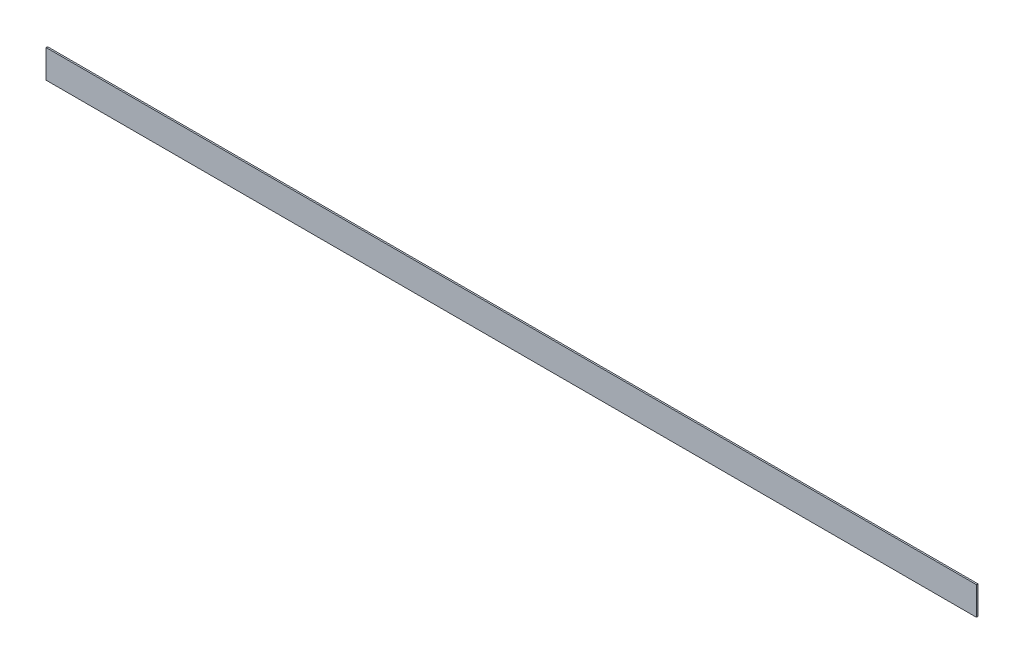
ISO-10303-21;
HEADER;
FILE_DESCRIPTION(('STEP AP214'),'2;1');
FILE_NAME('part.step','',(''),(''),'','','');
FILE_SCHEMA(('AUTOMOTIVE_DESIGN { 1 0 10303 214 1 1 1 1 }'));
ENDSEC;
DATA;
#1=APPLICATION_CONTEXT('core data for automotive mechanical design processes');
#2=APPLICATION_PROTOCOL_DEFINITION('international standard','automotive_design',2000,#1);
#3=PRODUCT_CONTEXT('',#1,'mechanical');
#4=PRODUCT('Part','Part','',(#3));
#5=PRODUCT_RELATED_PRODUCT_CATEGORY('part','',(#4));
#6=PRODUCT_DEFINITION_FORMATION('','',#4);
#7=PRODUCT_DEFINITION_CONTEXT('part definition',#1,'design');
#8=PRODUCT_DEFINITION('design','',#6,#7);
#9=PRODUCT_DEFINITION_SHAPE('','',#8);
#10=(LENGTH_UNIT() NAMED_UNIT(*) SI_UNIT(.MILLI.,.METRE.));
#11=(NAMED_UNIT(*) PLANE_ANGLE_UNIT() SI_UNIT($,.RADIAN.));
#12=(NAMED_UNIT(*) SI_UNIT($,.STERADIAN.) SOLID_ANGLE_UNIT());
#13=UNCERTAINTY_MEASURE_WITH_UNIT(LENGTH_MEASURE(1.E-05),#10,'distance_accuracy_value','');
#14=(GEOMETRIC_REPRESENTATION_CONTEXT(3) GLOBAL_UNCERTAINTY_ASSIGNED_CONTEXT((#13)) GLOBAL_UNIT_ASSIGNED_CONTEXT((#10,
#11,#12)) REPRESENTATION_CONTEXT('',''));
#15=CARTESIAN_POINT('',(0.,0.,0.));
#16=DIRECTION('',(0.,0.,1.));
#17=DIRECTION('',(1.,0.,0.));
#18=AXIS2_PLACEMENT_3D('',#15,#16,#17);
#19=CARTESIAN_POINT('',(-1318.73097433642,0.,25.4));
#20=DIRECTION('',(1.,0.,0.));
#21=DIRECTION('',(0.,0.,-1.));
#22=AXIS2_PLACEMENT_3D('',#19,#20,#21);
#23=PLANE('',#22);
#24=DIRECTION('',(0.,-1.,0.));
#25=VECTOR('',#24,1.);
#26=CARTESIAN_POINT('',(-1318.73097433642,0.,0.));
#27=LINE('',#26,#25);
#28=CARTESIAN_POINT('',(-1318.73097433642,481.496334187349,0.));
#29=VERTEX_POINT('',#28);
#30=CARTESIAN_POINT('',(-1318.73097433642,0.,0.));
#31=VERTEX_POINT('',#30);
#32=EDGE_CURVE('E96',#29,#31,#27,.T.);
#33=ORIENTED_EDGE('',*,*,#32,.T.);
#34=DIRECTION('',(0.,0.,-1.));
#35=VECTOR('',#34,1.);
#36=CARTESIAN_POINT('',(-1318.73097433642,0.,25.4));
#37=LINE('',#36,#35);
#38=CARTESIAN_POINT('',(-1318.73097433642,0.,25.4));
#39=VERTEX_POINT('',#38);
#40=EDGE_CURVE('E11',#39,#31,#37,.T.);
#41=ORIENTED_EDGE('',*,*,#40,.F.);
#42=DIRECTION('',(0.,-1.,0.));
#43=VECTOR('',#42,1.);
#44=CARTESIAN_POINT('',(-1318.73097433642,0.,25.4));
#45=LINE('',#44,#43);
#46=CARTESIAN_POINT('',(-1318.73097433642,481.496334187349,25.4));
#47=VERTEX_POINT('',#46);
#48=EDGE_CURVE('E84',#47,#39,#45,.T.);
#49=ORIENTED_EDGE('',*,*,#48,.F.);
#50=DIRECTION('',(0.,0.,-1.));
#51=VECTOR('',#50,1.);
#52=CARTESIAN_POINT('',(-1318.73097433642,481.496334187349,25.4));
#53=LINE('',#52,#51);
#54=EDGE_CURVE('E92',#47,#29,#53,.T.);
#55=ORIENTED_EDGE('',*,*,#54,.T.);
#56=EDGE_LOOP('',(#33,#41,#49,#55));
#57=FACE_BOUND('',#56,.T.);
#58=ADVANCED_FACE('F33',(#57),#23,.F.);
#59=CARTESIAN_POINT('',(-1318.73097433642,0.,25.4));
#60=DIRECTION('',(0.,1.,0.));
#61=DIRECTION('',(0.,0.,1.));
#62=AXIS2_PLACEMENT_3D('',#59,#60,#61);
#63=PLANE('',#62);
#64=DIRECTION('',(1.,0.,0.));
#65=VECTOR('',#64,1.);
#66=CARTESIAN_POINT('',(-1318.73097433642,0.,0.));
#67=LINE('',#66,#65);
#68=CARTESIAN_POINT('',(14522.2008467824,0.,0.));
#69=VERTEX_POINT('',#68);
#70=EDGE_CURVE('E88',#31,#69,#67,.T.);
#71=ORIENTED_EDGE('',*,*,#70,.T.);
#72=DIRECTION('',(0.,0.,-1.));
#73=VECTOR('',#72,1.);
#74=CARTESIAN_POINT('',(14522.2008467824,0.,25.4));
#75=LINE('',#74,#73);
#76=CARTESIAN_POINT('',(14522.2008467824,0.,25.4));
#77=VERTEX_POINT('',#76);
#78=EDGE_CURVE('E41',#77,#69,#75,.T.);
#79=ORIENTED_EDGE('',*,*,#78,.F.);
#80=DIRECTION('',(1.,0.,0.));
#81=VECTOR('',#80,1.);
#82=CARTESIAN_POINT('',(-1318.73097433642,0.,25.4));
#83=LINE('',#82,#81);
#84=EDGE_CURVE('E79',#39,#77,#83,.T.);
#85=ORIENTED_EDGE('',*,*,#84,.F.);
#86=ORIENTED_EDGE('',*,*,#40,.T.);
#87=EDGE_LOOP('',(#71,#79,#85,#86));
#88=FACE_BOUND('',#87,.T.);
#89=ADVANCED_FACE('F87',(#88),#63,.F.);
#90=CARTESIAN_POINT('',(14522.2008467824,0.,25.4));
#91=DIRECTION('',(-1.,0.,0.));
#92=DIRECTION('',(0.,0.,1.));
#93=AXIS2_PLACEMENT_3D('',#90,#91,#92);
#94=PLANE('',#93);
#95=DIRECTION('',(0.,1.,0.));
#96=VECTOR('',#95,1.);
#97=CARTESIAN_POINT('',(14522.2008467824,0.,0.));
#98=LINE('',#97,#96);
#99=CARTESIAN_POINT('',(14522.2008467824,481.496334187349,0.));
#100=VERTEX_POINT('',#99);
#101=EDGE_CURVE('E66',#69,#100,#98,.T.);
#102=ORIENTED_EDGE('',*,*,#101,.T.);
#103=DIRECTION('',(0.,0.,-1.));
#104=VECTOR('',#103,1.);
#105=CARTESIAN_POINT('',(14522.2008467824,481.496334187349,25.4));
#106=LINE('',#105,#104);
#107=CARTESIAN_POINT('',(14522.2008467824,481.496334187349,25.4));
#108=VERTEX_POINT('',#107);
#109=EDGE_CURVE('E89',#108,#100,#106,.T.);
#110=ORIENTED_EDGE('',*,*,#109,.F.);
#111=DIRECTION('',(0.,1.,0.));
#112=VECTOR('',#111,1.);
#113=CARTESIAN_POINT('',(14522.2008467824,0.,25.4));
#114=LINE('',#113,#112);
#115=EDGE_CURVE('E82',#77,#108,#114,.T.);
#116=ORIENTED_EDGE('',*,*,#115,.F.);
#117=ORIENTED_EDGE('',*,*,#78,.T.);
#118=EDGE_LOOP('',(#102,#110,#116,#117));
#119=FACE_BOUND('',#118,.T.);
#120=ADVANCED_FACE('F90',(#119),#94,.F.);
#121=CARTESIAN_POINT('',(-1318.73097433642,481.496334187349,25.4));
#122=DIRECTION('',(0.,-1.,0.));
#123=DIRECTION('',(0.,0.,-1.));
#124=AXIS2_PLACEMENT_3D('',#121,#122,#123);
#125=PLANE('',#124);
#126=DIRECTION('',(-1.,0.,0.));
#127=VECTOR('',#126,1.);
#128=CARTESIAN_POINT('',(-1318.73097433642,481.496334187349,0.));
#129=LINE('',#128,#127);
#130=EDGE_CURVE('E72',#100,#29,#129,.T.);
#131=ORIENTED_EDGE('',*,*,#130,.T.);
#132=ORIENTED_EDGE('',*,*,#54,.F.);
#133=DIRECTION('',(-1.,0.,0.));
#134=VECTOR('',#133,1.);
#135=CARTESIAN_POINT('',(-1318.73097433642,481.496334187349,25.4));
#136=LINE('',#135,#134);
#137=EDGE_CURVE('E49',#108,#47,#136,.T.);
#138=ORIENTED_EDGE('',*,*,#137,.F.);
#139=ORIENTED_EDGE('',*,*,#109,.T.);
#140=EDGE_LOOP('',(#131,#132,#138,#139));
#141=FACE_BOUND('',#140,.T.);
#142=ADVANCED_FACE('F103',(#141),#125,.F.);
#143=CARTESIAN_POINT('',(0.,0.,25.4));
#144=DIRECTION('',(0.,0.,-1.));
#145=DIRECTION('',(-1.,0.,0.));
#146=AXIS2_PLACEMENT_3D('',#143,#144,#145);
#147=PLANE('',#146);
#148=ORIENTED_EDGE('',*,*,#48,.T.);
#149=ORIENTED_EDGE('',*,*,#84,.T.);
#150=ORIENTED_EDGE('',*,*,#115,.T.);
#151=ORIENTED_EDGE('',*,*,#137,.T.);
#152=EDGE_LOOP('',(#148,#149,#150,#151));
#153=FACE_BOUND('',#152,.T.);
#154=ADVANCED_FACE('F80',(#153),#147,.F.);
#155=CARTESIAN_POINT('',(0.,0.,0.));
#156=DIRECTION('',(0.,0.,-1.));
#157=DIRECTION('',(-1.,0.,0.));
#158=AXIS2_PLACEMENT_3D('',#155,#156,#157);
#159=PLANE('',#158);
#160=ORIENTED_EDGE('',*,*,#32,.F.);
#161=ORIENTED_EDGE('',*,*,#130,.F.);
#162=ORIENTED_EDGE('',*,*,#101,.F.);
#163=ORIENTED_EDGE('',*,*,#70,.F.);
#164=EDGE_LOOP('',(#160,#161,#162,#163));
#165=FACE_BOUND('',#164,.T.);
#166=ADVANCED_FACE('F106',(#165),#159,.T.);
#167=CLOSED_SHELL('',(#58,#89,#120,#142,#154,#166));
#168=MANIFOLD_SOLID_BREP('B2',#167);
#169=ADVANCED_BREP_SHAPE_REPRESENTATION('',(#18,#168),#14);
#170=SHAPE_DEFINITION_REPRESENTATION(#9,#169);
ENDSEC;
END-ISO-10303-21;
